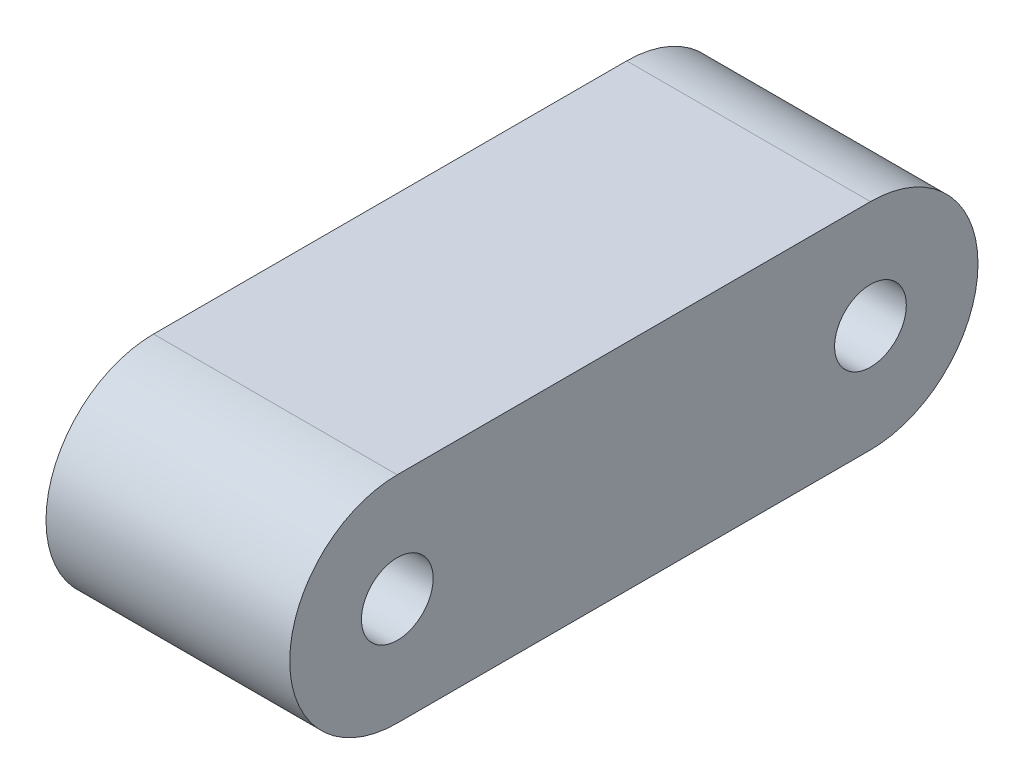
ISO-10303-21;
HEADER;
FILE_DESCRIPTION(('STEP AP214'),'2;1');
FILE_NAME('part.step','',(''),(''),'','','');
FILE_SCHEMA(('AUTOMOTIVE_DESIGN { 1 0 10303 214 1 1 1 1 }'));
ENDSEC;
DATA;
#1=APPLICATION_CONTEXT('core data for automotive mechanical design processes');
#2=APPLICATION_PROTOCOL_DEFINITION('international standard','automotive_design',2000,#1);
#3=PRODUCT_CONTEXT('',#1,'mechanical');
#4=PRODUCT('Part','Part','',(#3));
#5=PRODUCT_RELATED_PRODUCT_CATEGORY('part','',(#4));
#6=PRODUCT_DEFINITION_FORMATION('','',#4);
#7=PRODUCT_DEFINITION_CONTEXT('part definition',#1,'design');
#8=PRODUCT_DEFINITION('design','',#6,#7);
#9=PRODUCT_DEFINITION_SHAPE('','',#8);
#10=(LENGTH_UNIT() NAMED_UNIT(*) SI_UNIT(.MILLI.,.METRE.));
#11=(NAMED_UNIT(*) PLANE_ANGLE_UNIT() SI_UNIT($,.RADIAN.));
#12=(NAMED_UNIT(*) SI_UNIT($,.STERADIAN.) SOLID_ANGLE_UNIT());
#13=UNCERTAINTY_MEASURE_WITH_UNIT(LENGTH_MEASURE(1.E-05),#10,'distance_accuracy_value','');
#14=(GEOMETRIC_REPRESENTATION_CONTEXT(3) GLOBAL_UNCERTAINTY_ASSIGNED_CONTEXT((#13)) GLOBAL_UNIT_ASSIGNED_CONTEXT((#10,
#11,#12)) REPRESENTATION_CONTEXT('',''));
#15=CARTESIAN_POINT('',(0.,0.,0.));
#16=DIRECTION('',(0.,0.,1.));
#17=DIRECTION('',(1.,0.,0.));
#18=AXIS2_PLACEMENT_3D('',#15,#16,#17);
#19=CARTESIAN_POINT('',(8.5,0.,16.5));
#20=DIRECTION('',(1.,0.,0.));
#21=DIRECTION('',(0.,0.,-1.));
#22=AXIS2_PLACEMENT_3D('',#19,#20,#21);
#23=PLANE('',#22);
#24=CARTESIAN_POINT('',(8.5,0.,16.5));
#25=DIRECTION('',(1.,0.,0.));
#26=DIRECTION('',(0.,0.,-1.));
#27=AXIS2_PLACEMENT_3D('',#24,#25,#26);
#28=CIRCLE('',#27,2.5);
#29=CARTESIAN_POINT('',(8.5,0.,14.));
#30=VERTEX_POINT('',#29);
#31=EDGE_CURVE('E100',#30,#30,#28,.T.);
#32=ORIENTED_EDGE('',*,*,#31,.F.);
#33=EDGE_LOOP('',(#32));
#34=FACE_BOUND('',#33,.T.);
#35=CARTESIAN_POINT('',(8.5,0.,16.5));
#36=DIRECTION('',(1.,0.,0.));
#37=DIRECTION('',(0.,0.,-1.));
#38=AXIS2_PLACEMENT_3D('',#35,#36,#37);
#39=CIRCLE('',#38,7.49999999999999);
#40=CARTESIAN_POINT('',(8.5,7.49999999999998,16.5));
#41=VERTEX_POINT('',#40);
#42=CARTESIAN_POINT('',(8.5,-7.49999999999999,16.5));
#43=VERTEX_POINT('',#42);
#44=EDGE_CURVE('E85',#41,#43,#39,.T.);
#45=ORIENTED_EDGE('',*,*,#44,.T.);
#46=DIRECTION('',(0.,0.,-1.));
#47=VECTOR('',#46,1.);
#48=CARTESIAN_POINT('',(8.5,-7.49999999999999,16.5));
#49=LINE('',#48,#47);
#50=CARTESIAN_POINT('',(8.5,-7.49999999999998,-16.5));
#51=VERTEX_POINT('',#50);
#52=EDGE_CURVE('E80',#43,#51,#49,.T.);
#53=ORIENTED_EDGE('',*,*,#52,.T.);
#54=CARTESIAN_POINT('',(8.5,0.,-16.5));
#55=DIRECTION('',(1.,0.,0.));
#56=DIRECTION('',(0.,0.,-1.));
#57=AXIS2_PLACEMENT_3D('',#54,#55,#56);
#58=CIRCLE('',#57,7.49999999999999);
#59=CARTESIAN_POINT('',(8.5,7.49999999999999,-16.5));
#60=VERTEX_POINT('',#59);
#61=EDGE_CURVE('E83',#51,#60,#58,.T.);
#62=ORIENTED_EDGE('',*,*,#61,.T.);
#63=DIRECTION('',(0.,0.,1.));
#64=VECTOR('',#63,1.);
#65=CARTESIAN_POINT('',(8.5,7.49999999999998,16.5));
#66=LINE('',#65,#64);
#67=EDGE_CURVE('E50',#60,#41,#66,.T.);
#68=ORIENTED_EDGE('',*,*,#67,.T.);
#69=EDGE_LOOP('',(#45,#53,#62,#68));
#70=FACE_BOUND('',#69,.T.);
#71=CARTESIAN_POINT('',(8.5,0.,-16.5));
#72=DIRECTION('',(1.,0.,0.));
#73=DIRECTION('',(0.,0.,-1.));
#74=AXIS2_PLACEMENT_3D('',#71,#72,#73);
#75=CIRCLE('',#74,2.5);
#76=CARTESIAN_POINT('',(8.5,0.,-19.));
#77=VERTEX_POINT('',#76);
#78=EDGE_CURVE('E115',#77,#77,#75,.T.);
#79=ORIENTED_EDGE('',*,*,#78,.F.);
#80=EDGE_LOOP('',(#79));
#81=FACE_BOUND('',#80,.T.);
#82=ADVANCED_FACE('F33',(#34,#70,#81),#23,.T.);
#83=CARTESIAN_POINT('',(-8.5,0.,16.5));
#84=DIRECTION('',(1.,0.,0.));
#85=DIRECTION('',(0.,0.,-1.));
#86=AXIS2_PLACEMENT_3D('',#83,#84,#85);
#87=PLANE('',#86);
#88=CARTESIAN_POINT('',(-8.5,0.,16.5));
#89=DIRECTION('',(1.,0.,0.));
#90=DIRECTION('',(0.,0.,-1.));
#91=AXIS2_PLACEMENT_3D('',#88,#89,#90);
#92=CIRCLE('',#91,7.49999999999999);
#93=CARTESIAN_POINT('',(-8.5,7.49999999999998,16.5));
#94=VERTEX_POINT('',#93);
#95=CARTESIAN_POINT('',(-8.5,-7.49999999999999,16.5));
#96=VERTEX_POINT('',#95);
#97=EDGE_CURVE('E97',#94,#96,#92,.T.);
#98=ORIENTED_EDGE('',*,*,#97,.F.);
#99=DIRECTION('',(0.,0.,1.));
#100=VECTOR('',#99,1.);
#101=CARTESIAN_POINT('',(-8.5,7.49999999999998,16.5));
#102=LINE('',#101,#100);
#103=CARTESIAN_POINT('',(-8.5,7.49999999999999,-16.5));
#104=VERTEX_POINT('',#103);
#105=EDGE_CURVE('E73',#104,#94,#102,.T.);
#106=ORIENTED_EDGE('',*,*,#105,.F.);
#107=CARTESIAN_POINT('',(-8.5,0.,-16.5));
#108=DIRECTION('',(1.,0.,0.));
#109=DIRECTION('',(0.,0.,-1.));
#110=AXIS2_PLACEMENT_3D('',#107,#108,#109);
#111=CIRCLE('',#110,7.49999999999999);
#112=CARTESIAN_POINT('',(-8.5,-7.49999999999998,-16.5));
#113=VERTEX_POINT('',#112);
#114=EDGE_CURVE('E67',#113,#104,#111,.T.);
#115=ORIENTED_EDGE('',*,*,#114,.F.);
#116=DIRECTION('',(0.,0.,-1.));
#117=VECTOR('',#116,1.);
#118=CARTESIAN_POINT('',(-8.5,-7.49999999999999,16.5));
#119=LINE('',#118,#117);
#120=EDGE_CURVE('E89',#96,#113,#119,.T.);
#121=ORIENTED_EDGE('',*,*,#120,.F.);
#122=EDGE_LOOP('',(#98,#106,#115,#121));
#123=FACE_BOUND('',#122,.T.);
#124=CARTESIAN_POINT('',(-8.5,0.,16.5));
#125=DIRECTION('',(1.,0.,0.));
#126=DIRECTION('',(0.,0.,-1.));
#127=AXIS2_PLACEMENT_3D('',#124,#125,#126);
#128=CIRCLE('',#127,2.5);
#129=CARTESIAN_POINT('',(-8.5,0.,14.));
#130=VERTEX_POINT('',#129);
#131=EDGE_CURVE('E112',#130,#130,#128,.T.);
#132=ORIENTED_EDGE('',*,*,#131,.T.);
#133=EDGE_LOOP('',(#132));
#134=FACE_BOUND('',#133,.T.);
#135=CARTESIAN_POINT('',(-8.5,0.,-16.5));
#136=DIRECTION('',(1.,0.,0.));
#137=DIRECTION('',(0.,0.,-1.));
#138=AXIS2_PLACEMENT_3D('',#135,#136,#137);
#139=CIRCLE('',#138,2.5);
#140=CARTESIAN_POINT('',(-8.5,0.,-19.));
#141=VERTEX_POINT('',#140);
#142=EDGE_CURVE('E118',#141,#141,#139,.T.);
#143=ORIENTED_EDGE('',*,*,#142,.T.);
#144=EDGE_LOOP('',(#143));
#145=FACE_BOUND('',#144,.T.);
#146=ADVANCED_FACE('F108',(#123,#134,#145),#87,.F.);
#147=CARTESIAN_POINT('',(8.5,0.,16.5));
#148=DIRECTION('',(-1.,0.,0.));
#149=DIRECTION('',(0.,0.,1.));
#150=AXIS2_PLACEMENT_3D('',#147,#148,#149);
#151=CYLINDRICAL_SURFACE('',#150,7.49999999999999);
#152=ORIENTED_EDGE('',*,*,#97,.T.);
#153=DIRECTION('',(-1.,0.,0.));
#154=VECTOR('',#153,1.);
#155=CARTESIAN_POINT('',(8.5,-7.49999999999999,16.5));
#156=LINE('',#155,#154);
#157=EDGE_CURVE('E11',#43,#96,#156,.T.);
#158=ORIENTED_EDGE('',*,*,#157,.F.);
#159=ORIENTED_EDGE('',*,*,#44,.F.);
#160=DIRECTION('',(-1.,0.,0.));
#161=VECTOR('',#160,1.);
#162=CARTESIAN_POINT('',(8.5,7.49999999999998,16.5));
#163=LINE('',#162,#161);
#164=EDGE_CURVE('E93',#41,#94,#163,.T.);
#165=ORIENTED_EDGE('',*,*,#164,.T.);
#166=EDGE_LOOP('',(#152,#158,#159,#165));
#167=FACE_BOUND('',#166,.T.);
#168=ADVANCED_FACE('F35',(#167),#151,.T.);
#169=CARTESIAN_POINT('',(8.5,-7.49999999999999,16.5));
#170=DIRECTION('',(0.,1.,0.));
#171=DIRECTION('',(0.,0.,1.));
#172=AXIS2_PLACEMENT_3D('',#169,#170,#171);
#173=PLANE('',#172);
#174=ORIENTED_EDGE('',*,*,#120,.T.);
#175=DIRECTION('',(-1.,0.,0.));
#176=VECTOR('',#175,1.);
#177=CARTESIAN_POINT('',(8.5,-7.49999999999998,-16.5));
#178=LINE('',#177,#176);
#179=EDGE_CURVE('E42',#51,#113,#178,.T.);
#180=ORIENTED_EDGE('',*,*,#179,.F.);
#181=ORIENTED_EDGE('',*,*,#52,.F.);
#182=ORIENTED_EDGE('',*,*,#157,.T.);
#183=EDGE_LOOP('',(#174,#180,#181,#182));
#184=FACE_BOUND('',#183,.T.);
#185=ADVANCED_FACE('F88',(#184),#173,.F.);
#186=CARTESIAN_POINT('',(8.5,0.,-16.5));
#187=DIRECTION('',(-1.,0.,0.));
#188=DIRECTION('',(0.,0.,1.));
#189=AXIS2_PLACEMENT_3D('',#186,#187,#188);
#190=CYLINDRICAL_SURFACE('',#189,7.49999999999999);
#191=ORIENTED_EDGE('',*,*,#114,.T.);
#192=DIRECTION('',(-1.,0.,0.));
#193=VECTOR('',#192,1.);
#194=CARTESIAN_POINT('',(8.5,7.49999999999999,-16.5));
#195=LINE('',#194,#193);
#196=EDGE_CURVE('E90',#60,#104,#195,.T.);
#197=ORIENTED_EDGE('',*,*,#196,.F.);
#198=ORIENTED_EDGE('',*,*,#61,.F.);
#199=ORIENTED_EDGE('',*,*,#179,.T.);
#200=EDGE_LOOP('',(#191,#197,#198,#199));
#201=FACE_BOUND('',#200,.T.);
#202=ADVANCED_FACE('F91',(#201),#190,.T.);
#203=CARTESIAN_POINT('',(8.5,7.49999999999998,16.5));
#204=DIRECTION('',(0.,-1.,0.));
#205=DIRECTION('',(0.,0.,-1.));
#206=AXIS2_PLACEMENT_3D('',#203,#204,#205);
#207=PLANE('',#206);
#208=ORIENTED_EDGE('',*,*,#105,.T.);
#209=ORIENTED_EDGE('',*,*,#164,.F.);
#210=ORIENTED_EDGE('',*,*,#67,.F.);
#211=ORIENTED_EDGE('',*,*,#196,.T.);
#212=EDGE_LOOP('',(#208,#209,#210,#211));
#213=FACE_BOUND('',#212,.T.);
#214=ADVANCED_FACE('F105',(#213),#207,.F.);
#215=CARTESIAN_POINT('',(8.5,0.,16.5));
#216=DIRECTION('',(-1.,0.,0.));
#217=DIRECTION('',(0.,0.,1.));
#218=AXIS2_PLACEMENT_3D('',#215,#216,#217);
#219=CYLINDRICAL_SURFACE('',#218,2.5);
#220=ORIENTED_EDGE('',*,*,#31,.T.);
#221=EDGE_LOOP('',(#220));
#222=FACE_BOUND('',#221,.T.);
#223=ORIENTED_EDGE('',*,*,#131,.F.);
#224=EDGE_LOOP('',(#223));
#225=FACE_BOUND('',#224,.T.);
#226=ADVANCED_FACE('F135',(#222,#225),#219,.F.);
#227=CARTESIAN_POINT('',(8.5,0.,-16.5));
#228=DIRECTION('',(-1.,0.,0.));
#229=DIRECTION('',(0.,0.,1.));
#230=AXIS2_PLACEMENT_3D('',#227,#228,#229);
#231=CYLINDRICAL_SURFACE('',#230,2.5);
#232=ORIENTED_EDGE('',*,*,#78,.T.);
#233=EDGE_LOOP('',(#232));
#234=FACE_BOUND('',#233,.T.);
#235=ORIENTED_EDGE('',*,*,#142,.F.);
#236=EDGE_LOOP('',(#235));
#237=FACE_BOUND('',#236,.T.);
#238=ADVANCED_FACE('F124',(#234,#237),#231,.F.);
#239=CLOSED_SHELL('',(#82,#146,#168,#185,#202,#214,#226,#238));
#240=MANIFOLD_SOLID_BREP('B2',#239);
#241=ADVANCED_BREP_SHAPE_REPRESENTATION('',(#18,#240),#14);
#242=SHAPE_DEFINITION_REPRESENTATION(#9,#241);
ENDSEC;
END-ISO-10303-21;
